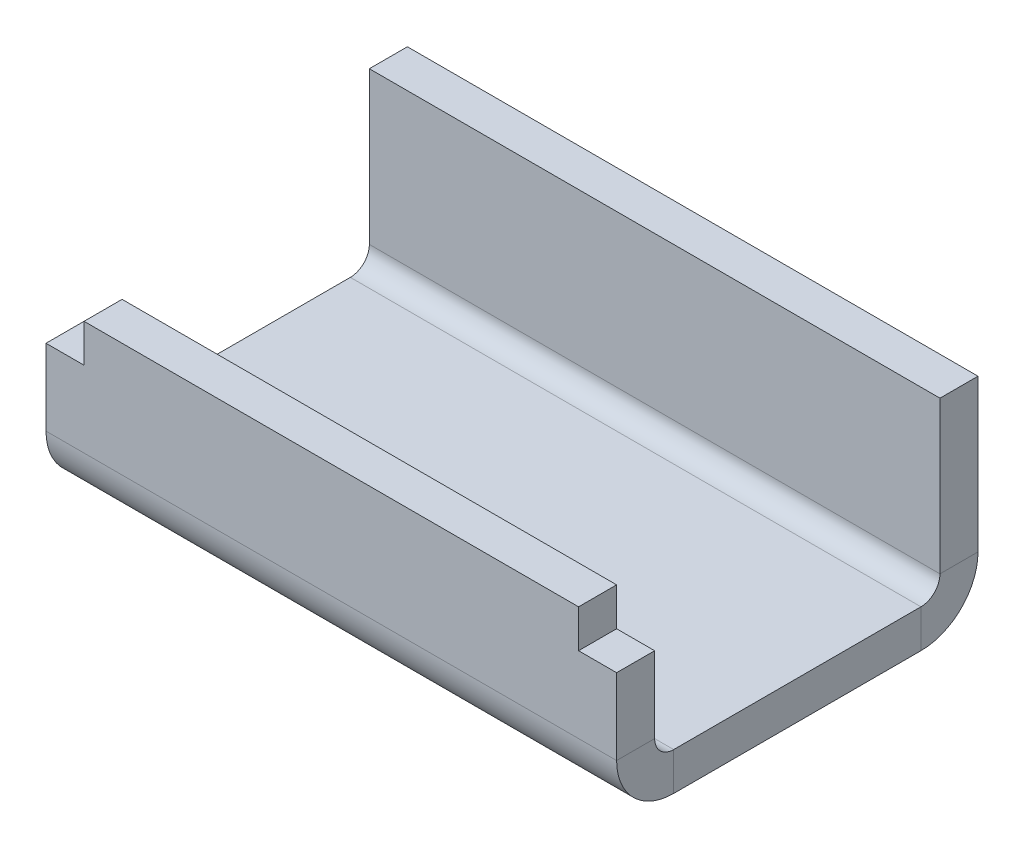
ISO-10303-21;
HEADER;
FILE_DESCRIPTION(('STEP AP214'),'2;1');
FILE_NAME('part.step','',(''),(''),'','','');
FILE_SCHEMA(('AUTOMOTIVE_DESIGN { 1 0 10303 214 1 1 1 1 }'));
ENDSEC;
DATA;
#1=APPLICATION_CONTEXT('core data for automotive mechanical design processes');
#2=APPLICATION_PROTOCOL_DEFINITION('international standard','automotive_design',2000,#1);
#3=PRODUCT_CONTEXT('',#1,'mechanical');
#4=PRODUCT('Part','Part','',(#3));
#5=PRODUCT_RELATED_PRODUCT_CATEGORY('part','',(#4));
#6=PRODUCT_DEFINITION_FORMATION('','',#4);
#7=PRODUCT_DEFINITION_CONTEXT('part definition',#1,'design');
#8=PRODUCT_DEFINITION('design','',#6,#7);
#9=PRODUCT_DEFINITION_SHAPE('','',#8);
#10=(LENGTH_UNIT() NAMED_UNIT(*) SI_UNIT(.MILLI.,.METRE.));
#11=(NAMED_UNIT(*) PLANE_ANGLE_UNIT() SI_UNIT($,.RADIAN.));
#12=(NAMED_UNIT(*) SI_UNIT($,.STERADIAN.) SOLID_ANGLE_UNIT());
#13=UNCERTAINTY_MEASURE_WITH_UNIT(LENGTH_MEASURE(1.E-05),#10,'distance_accuracy_value','');
#14=(GEOMETRIC_REPRESENTATION_CONTEXT(3) GLOBAL_UNCERTAINTY_ASSIGNED_CONTEXT((#13)) GLOBAL_UNIT_ASSIGNED_CONTEXT((#10,
#11,#12)) REPRESENTATION_CONTEXT('',''));
#15=CARTESIAN_POINT('',(0.,0.,0.));
#16=DIRECTION('',(0.,0.,1.));
#17=DIRECTION('',(1.,0.,0.));
#18=AXIS2_PLACEMENT_3D('',#15,#16,#17);
#19=CARTESIAN_POINT('',(-5.39078E-12,-0.06434426229563,-0.02));
#20=DIRECTION('',(0.,0.,1.));
#21=DIRECTION('',(0.,-1.,0.));
#22=AXIS2_PLACEMENT_3D('',#19,#20,#21);
#23=PLANE('',#22);
#24=DIRECTION('',(1.,0.,0.));
#25=VECTOR('',#24,1.);
#26=CARTESIAN_POINT('',(-0.150000000006,0.01,-0.02));
#27=LINE('',#26,#25);
#28=CARTESIAN_POINT('',(-0.150000000006,0.01,-0.02));
#29=VERTEX_POINT('',#28);
#30=CARTESIAN_POINT('',(0.149999999994,0.01,-0.02));
#31=VERTEX_POINT('',#30);
#32=EDGE_CURVE('E293',#29,#31,#27,.T.);
#33=ORIENTED_EDGE('',*,*,#32,.F.);
#34=DIRECTION('',(0.,1.,0.));
#35=VECTOR('',#34,1.);
#36=CARTESIAN_POINT('',(-0.150000000006,-0.200000000011,-0.02));
#37=LINE('',#36,#35);
#38=CARTESIAN_POINT('',(-0.150000000006,0.09,-0.02));
#39=VERTEX_POINT('',#38);
#40=EDGE_CURVE('E27',#29,#39,#37,.T.);
#41=ORIENTED_EDGE('',*,*,#40,.T.);
#42=DIRECTION('',(1.,0.,0.));
#43=VECTOR('',#42,1.);
#44=CARTESIAN_POINT('',(-0.150000000006,0.09,-0.02));
#45=LINE('',#44,#43);
#46=CARTESIAN_POINT('',(0.149999999994,0.09,-0.02));
#47=VERTEX_POINT('',#46);
#48=EDGE_CURVE('E11',#39,#47,#45,.T.);
#49=ORIENTED_EDGE('',*,*,#48,.T.);
#50=DIRECTION('',(0.,-1.,0.));
#51=VECTOR('',#50,1.);
#52=CARTESIAN_POINT('',(0.149999999994,0.09,-0.02));
#53=LINE('',#52,#51);
#54=EDGE_CURVE('E307',#47,#31,#53,.T.);
#55=ORIENTED_EDGE('',*,*,#54,.T.);
#56=EDGE_LOOP('',(#33,#41,#49,#55));
#57=FACE_BOUND('',#56,.T.);
#58=ADVANCED_FACE('F17',(#57),#23,.F.);
#59=CARTESIAN_POINT('',(-0.150000000006,0.09,0.));
#60=DIRECTION('',(0.,-1.,0.));
#61=DIRECTION('',(0.,0.,-1.));
#62=AXIS2_PLACEMENT_3D('',#59,#60,#61);
#63=PLANE('',#62);
#64=DIRECTION('',(0.,0.,-1.));
#65=VECTOR('',#64,1.);
#66=CARTESIAN_POINT('',(-0.150000000006,0.09,0.));
#67=LINE('',#66,#65);
#68=CARTESIAN_POINT('',(-0.150000000006,0.09,0.));
#69=VERTEX_POINT('',#68);
#70=EDGE_CURVE('E225',#69,#39,#67,.T.);
#71=ORIENTED_EDGE('',*,*,#70,.F.);
#72=DIRECTION('',(1.,0.,0.));
#73=VECTOR('',#72,1.);
#74=CARTESIAN_POINT('',(-0.150000000006,0.09,0.));
#75=LINE('',#74,#73);
#76=CARTESIAN_POINT('',(0.149999999994,0.09,0.));
#77=VERTEX_POINT('',#76);
#78=EDGE_CURVE('E294',#69,#77,#75,.T.);
#79=ORIENTED_EDGE('',*,*,#78,.T.);
#80=DIRECTION('',(0.,0.,-1.));
#81=VECTOR('',#80,1.);
#82=CARTESIAN_POINT('',(0.149999999994,0.09,0.));
#83=LINE('',#82,#81);
#84=EDGE_CURVE('E21',#77,#47,#83,.T.);
#85=ORIENTED_EDGE('',*,*,#84,.T.);
#86=ORIENTED_EDGE('',*,*,#48,.F.);
#87=EDGE_LOOP('',(#71,#79,#85,#86));
#88=FACE_BOUND('',#87,.T.);
#89=ADVANCED_FACE('F315',(#88),#63,.F.);
#90=CARTESIAN_POINT('',(-0.150000000006,-0.200000000011,0.));
#91=DIRECTION('',(1.,0.,0.));
#92=DIRECTION('',(0.,1.,0.));
#93=AXIS2_PLACEMENT_3D('',#90,#91,#92);
#94=PLANE('',#93);
#95=DIRECTION('',(0.,1.,0.));
#96=VECTOR('',#95,1.);
#97=CARTESIAN_POINT('',(-0.150000000006,-0.200000000011,0.));
#98=LINE('',#97,#96);
#99=CARTESIAN_POINT('',(-0.150000000006,0.01,0.));
#100=VERTEX_POINT('',#99);
#101=EDGE_CURVE('E289',#100,#69,#98,.T.);
#102=ORIENTED_EDGE('',*,*,#101,.T.);
#103=ORIENTED_EDGE('',*,*,#70,.T.);
#104=ORIENTED_EDGE('',*,*,#40,.F.);
#105=DIRECTION('',(0.,0.,-1.));
#106=VECTOR('',#105,1.);
#107=CARTESIAN_POINT('',(-0.150000000006,0.01,0.));
#108=LINE('',#107,#106);
#109=EDGE_CURVE('E288',#100,#29,#108,.T.);
#110=ORIENTED_EDGE('',*,*,#109,.F.);
#111=EDGE_LOOP('',(#102,#103,#104,#110));
#112=FACE_BOUND('',#111,.T.);
#113=ADVANCED_FACE('F19',(#112),#94,.F.);
#114=CARTESIAN_POINT('',(0.149999999994,0.09,0.));
#115=DIRECTION('',(-1.,0.,0.));
#116=DIRECTION('',(0.,0.,1.));
#117=AXIS2_PLACEMENT_3D('',#114,#115,#116);
#118=PLANE('',#117);
#119=DIRECTION('',(0.,-1.,0.));
#120=VECTOR('',#119,1.);
#121=CARTESIAN_POINT('',(0.149999999994,0.09,0.));
#122=LINE('',#121,#120);
#123=CARTESIAN_POINT('',(0.149999999994,0.01,0.));
#124=VERTEX_POINT('',#123);
#125=EDGE_CURVE('E204',#77,#124,#122,.T.);
#126=ORIENTED_EDGE('',*,*,#125,.T.);
#127=DIRECTION('',(0.,0.,-1.));
#128=VECTOR('',#127,1.);
#129=CARTESIAN_POINT('',(0.149999999994,0.01,0.));
#130=LINE('',#129,#128);
#131=EDGE_CURVE('E284',#124,#31,#130,.T.);
#132=ORIENTED_EDGE('',*,*,#131,.T.);
#133=ORIENTED_EDGE('',*,*,#54,.F.);
#134=ORIENTED_EDGE('',*,*,#84,.F.);
#135=EDGE_LOOP('',(#126,#132,#133,#134));
#136=FACE_BOUND('',#135,.T.);
#137=ADVANCED_FACE('F319',(#136),#118,.F.);
#138=CARTESIAN_POINT('',(-0.150000000006,0.01,0.01));
#139=DIRECTION('',(1.,0.,0.));
#140=DIRECTION('',(0.,0.,1.));
#141=AXIS2_PLACEMENT_3D('',#138,#139,#140);
#142=CYLINDRICAL_SURFACE('',#141,0.03);
#143=DIRECTION('',(-1.,0.,0.));
#144=VECTOR('',#143,1.);
#145=CARTESIAN_POINT('',(-0.150000000006,-0.02,0.01));
#146=LINE('',#145,#144);
#147=CARTESIAN_POINT('',(0.149999999994,-0.02,0.01));
#148=VERTEX_POINT('',#147);
#149=CARTESIAN_POINT('',(-0.150000000006,-0.02,0.01));
#150=VERTEX_POINT('',#149);
#151=EDGE_CURVE('E277',#148,#150,#146,.T.);
#152=ORIENTED_EDGE('',*,*,#151,.T.);
#153=CARTESIAN_POINT('',(-0.150000000006,0.00999999999999739,0.00999999999999739));
#154=DIRECTION('',(1.,0.,0.));
#155=DIRECTION('',(0.,0.,-1.));
#156=AXIS2_PLACEMENT_3D('',#153,#154,#155);
#157=CIRCLE('',#156,0.0299999999999974);
#158=EDGE_CURVE('E298',#150,#29,#157,.T.);
#159=ORIENTED_EDGE('',*,*,#158,.T.);
#160=ORIENTED_EDGE('',*,*,#32,.T.);
#161=CARTESIAN_POINT('',(0.149999999994,0.00999999999999722,0.00999999999999725));
#162=DIRECTION('',(-1.,0.,0.));
#163=DIRECTION('',(0.,-1.,0.));
#164=AXIS2_PLACEMENT_3D('',#161,#162,#163);
#165=CIRCLE('',#164,0.0299999999999972);
#166=EDGE_CURVE('E281',#31,#148,#165,.T.);
#167=ORIENTED_EDGE('',*,*,#166,.T.);
#168=EDGE_LOOP('',(#152,#159,#160,#167));
#169=FACE_BOUND('',#168,.T.);
#170=ADVANCED_FACE('F328',(#169),#142,.T.);
#171=CARTESIAN_POINT('',(-5.39078E-12,-0.06434426229563,0.));
#172=DIRECTION('',(0.,0.,1.));
#173=DIRECTION('',(0.,-1.,0.));
#174=AXIS2_PLACEMENT_3D('',#171,#172,#173);
#175=PLANE('',#174);
#176=DIRECTION('',(1.,0.,0.));
#177=VECTOR('',#176,1.);
#178=CARTESIAN_POINT('',(-0.150000000006,0.01,0.));
#179=LINE('',#178,#177);
#180=EDGE_CURVE('E245',#100,#124,#179,.T.);
#181=ORIENTED_EDGE('',*,*,#180,.T.);
#182=ORIENTED_EDGE('',*,*,#125,.F.);
#183=ORIENTED_EDGE('',*,*,#78,.F.);
#184=ORIENTED_EDGE('',*,*,#101,.F.);
#185=EDGE_LOOP('',(#181,#182,#183,#184));
#186=FACE_BOUND('',#185,.T.);
#187=ADVANCED_FACE('F366',(#186),#175,.T.);
#188=CARTESIAN_POINT('',(-0.150000000006,0.00293014320761232,0.0029301432076107));
#189=DIRECTION('',(-1.,0.,0.));
#190=DIRECTION('',(0.,0.,1.));
#191=AXIS2_PLACEMENT_3D('',#188,#189,#190);
#192=PLANE('',#191);
#193=CARTESIAN_POINT('',(-0.150000000006,0.,0.01));
#194=CARTESIAN_POINT('',(-0.150000000006,0.,0.009893145140566));
#195=CARTESIAN_POINT('',(-0.150000000006,1.71273217497177E-06,0.00978629333149694));
#196=CARTESIAN_POINT('',(-0.150000000006,5.13767503647344E-06,0.00967948930591211));
#197=CARTESIAN_POINT('',(-0.150000000006,8.5626178979759E-06,0.00957268528032725));
#198=CARTESIAN_POINT('',(-0.150000000006,1.36997278971819E-05,0.00946593514359925));
#199=CARTESIAN_POINT('',(-0.150000000006,2.05460724966439E-05,0.00935929780019276));
#200=CARTESIAN_POINT('',(-0.150000000006,2.73924170960974E-05,0.00925266045678639));
#201=CARTESIAN_POINT('',(-0.150000000006,3.59481483652578E-05,0.00914613285964536));
#202=CARTESIAN_POINT('',(-0.150000000006,4.62088705079945E-05,0.00903976974092342));
#203=CARTESIAN_POINT('',(-0.150000000006,5.64695926507638E-05,0.00893340662220115));
#204=CARTESIAN_POINT('',(-0.150000000006,6.84353056671169E-05,0.00882720798189799));
#205=CARTESIAN_POINT('',(-0.150000000006,8.20998617675744E-05,0.00872122838315467));
#206=CARTESIAN_POINT('',(-0.150000000006,9.57644178679983E-05,0.00861524878441161));
#207=CARTESIAN_POINT('',(-0.150000000006,0.00011112781705252,0.00850948822722841));
#208=CARTESIAN_POINT('',(-0.150000000006,0.000128182165855533,0.00840400104966599));
#209=CARTESIAN_POINT('',(-0.150000000006,0.000145236514658547,0.00829851387210358));
#210=CARTESIAN_POINT('',(-0.150000000006,0.000163981813080051,0.00819330007416197));
#211=CARTESIAN_POINT('',(-0.150000000006,0.000184408430089385,0.00808841371298608));
#212=CARTESIAN_POINT('',(-0.150000000006,0.000204835047098718,0.0079835273518102));
#213=CARTESIAN_POINT('',(-0.150000000006,0.000226942982695879,0.00787896842740005));
#214=CARTESIAN_POINT('',(-0.150000000006,0.000250720878181752,0.00777479066043691));
#215=CARTESIAN_POINT('',(-0.150000000006,0.000274498773667626,0.00767061289347377));
#216=CARTESIAN_POINT('',(-0.150000000006,0.000299946629042216,0.00756681628395764));
#217=CARTESIAN_POINT('',(-0.150000000006,0.000327051369609675,0.00746345416090504));
#218=CARTESIAN_POINT('',(-0.150000000006,0.000381260850744594,0.00725672991479985));
#219=CARTESIAN_POINT('',(-0.150000000006,0.000442099560027939,0.00705174411535318));
#220=CARTESIAN_POINT('',(-0.150000000006,0.000509442529893238,0.00684891781976402));
#221=CARTESIAN_POINT('',(-0.150000000006,0.000543114014825887,0.00674750467196944));
#222=CARTESIAN_POINT('',(-0.150000000006,0.00057841114305978,0.00664663127493813));
#223=CARTESIAN_POINT('',(-0.150000000006,0.000615315779502293,0.0065463494557872));
#224=CARTESIAN_POINT('',(-0.150000000006,0.000652220415944894,0.00644606763663603));
#225=CARTESIAN_POINT('',(-0.150000000006,0.000690732560596126,0.00634637739536524));
#226=CARTESIAN_POINT('',(-0.150000000006,0.000730832426539943,0.00624732995120586));
#227=CARTESIAN_POINT('',(-0.150000000006,0.000770932292483661,0.00614828250704672));
#228=CARTESIAN_POINT('',(-0.150000000006,0.000812619879719954,0.00604987785999899));
#229=CARTESIAN_POINT('',(-0.150000000006,0.000855873769841952,0.00595216656877589));
#230=CARTESIAN_POINT('',(-0.150000000006,0.00089912765996395,0.00585445527755279));
#231=CARTESIAN_POINT('',(-0.150000000006,0.000943947852971657,0.00575743734215433));
#232=CARTESIAN_POINT('',(-0.150000000006,0.000990311320975899,0.00566116260882423));
#233=CARTESIAN_POINT('',(-0.150000000006,0.00103667478898014,0.00556488787549413));
#234=CARTESIAN_POINT('',(-0.150000000006,0.00108458153198091,0.00546935634423239));
#235=CARTESIAN_POINT('',(-0.150000000006,0.0011340069362699,0.00537461709759184));
#236=CARTESIAN_POINT('',(-0.150000000006,0.00128228314913687,0.00509039935767018));
#237=CARTESIAN_POINT('',(-0.150000000006,0.00144423645844276,0.00481331745911238));
#238=CARTESIAN_POINT('',(-0.150000000006,0.00161911895108181,0.00454465098789418));
#239=CARTESIAN_POINT('',(-0.150000000006,0.00167741311529483,0.00445509549748811));
#240=CARTESIAN_POINT('',(-0.150000000006,0.00173714284566688,0.00436647445709802));
#241=CARTESIAN_POINT('',(-0.150000000006,0.00179827745403031,0.00427883339877848));
#242=CARTESIAN_POINT('',(-0.150000000006,0.0018594120623939,0.00419119234045873));
#243=CARTESIAN_POINT('',(-0.150000000006,0.00192195154874889,0.00410453126420954));
#244=CARTESIAN_POINT('',(-0.150000000006,0.00198586378132042,0.00401889469508785));
#245=CARTESIAN_POINT('',(-0.150000000006,0.0020497760138918,0.00393325812596638));
#246=CARTESIAN_POINT('',(-0.150000000006,0.00211506099267971,0.00384864606397241));
#247=CARTESIAN_POINT('',(-0.150000000006,0.00218168517531969,0.00376510198141269));
#248=CARTESIAN_POINT('',(-0.150000000006,0.00224830935795966,0.00368155789885295));
#249=CARTESIAN_POINT('',(-0.150000000006,0.00231627274445171,0.00359908179572746));
#250=CARTESIAN_POINT('',(-0.150000000006,0.00238554041630878,0.00351771604692197));
#251=CARTESIAN_POINT('',(-0.150000000006,0.00245480808816585,0.00343635029811647));
#252=CARTESIAN_POINT('',(-0.150000000006,0.00252538004538794,0.00335609490363096));
#253=CARTESIAN_POINT('',(-0.150000000006,0.00259722002924699,0.00327699109738667));
#254=CARTESIAN_POINT('',(-0.150000000006,0.00266906001310604,0.00319788729114238));
#255=CARTESIAN_POINT('',(-0.150000000006,0.00274216802360205,0.00311993507313931));
#256=CARTESIAN_POINT('',(-0.150000000006,0.00281650649902325,0.0030431744939646));
#257=CARTESIAN_POINT('',(-0.150000000006,0.0028908449744439,0.00296641391479045));
#258=CARTESIAN_POINT('',(-0.150000000006,0.00296641391478971,0.00289084497444464));
#259=CARTESIAN_POINT('',(-0.150000000006,0.00304317449396359,0.00281650649902422));
#260=CARTESIAN_POINT('',(-0.150000000006,0.00311993507313879,0.00274216802360253));
#261=CARTESIAN_POINT('',(-0.150000000006,0.00319788729114211,0.00266906001310627));
#262=CARTESIAN_POINT('',(-0.150000000006,0.00327699109738686,0.00259722002924682));
#263=CARTESIAN_POINT('',(-0.150000000006,0.00335609490363161,0.00252538004538736));
#264=CARTESIAN_POINT('',(-0.150000000006,0.00343635029811778,0.0024548080881647));
#265=CARTESIAN_POINT('',(-0.150000000006,0.00351771604692396,0.00238554041630708));
#266=CARTESIAN_POINT('',(-0.150000000006,0.00359908179572815,0.00231627274445117));
#267=CARTESIAN_POINT('',(-0.150000000006,0.00368155789885228,0.00224830935796023));
#268=CARTESIAN_POINT('',(-0.150000000006,0.00376510198141101,0.00218168517532102));
#269=CARTESIAN_POINT('',(-0.150000000006,0.00384864606397178,0.00211506099268018));
#270=CARTESIAN_POINT('',(-0.150000000006,0.0039332581259672,0.00204977601389115));
#271=CARTESIAN_POINT('',(-0.150000000006,0.00401889469508981,0.00198586378131896));
#272=CARTESIAN_POINT('',(-0.150000000006,0.00410453126421032,0.00192195154874834));
#273=CARTESIAN_POINT('',(-0.150000000006,0.00419119234045796,0.00185941206239448));
#274=CARTESIAN_POINT('',(-0.150000000006,0.00427883339877623,0.00179827745403189));
#275=CARTESIAN_POINT('',(-0.150000000006,0.00436647445709665,0.0017371428456678));
#276=CARTESIAN_POINT('',(-0.150000000006,0.00445509549748777,0.00167741311529504));
#277=CARTESIAN_POINT('',(-0.150000000006,0.00454465098789468,0.00161911895108148));
#278=CARTESIAN_POINT('',(-0.150000000006,0.0046342064783016,0.00156082478686792));
#279=CARTESIAN_POINT('',(-0.150000000006,0.00472469641872432,0.00150396618881355));
#280=CARTESIAN_POINT('',(-0.150000000006,0.00481607431689735,0.00144857236994496));
#281=CARTESIAN_POINT('',(-0.150000000006,0.00490745221506815,0.00139317855107772));
#282=CARTESIAN_POINT('',(-0.150000000006,0.00499971807098923,0.00133924951139618));
#283=CARTESIAN_POINT('',(-0.150000000006,0.00509282447995906,0.00128681295876699));
#284=CARTESIAN_POINT('',(-0.150000000006,0.00518593088893116,0.00123437640613651));
#285=CARTESIAN_POINT('',(-0.150000000006,0.00527987785095204,0.00118343234055847));
#286=CARTESIAN_POINT('',(-0.150000000006,0.0053746170975939,0.00113400693626882));
#287=CARTESIAN_POINT('',(-0.150000000006,0.00546935634423343,0.00108458153198039));
#288=CARTESIAN_POINT('',(-0.150000000006,0.0055648878754939,0.00103667478898028));
#289=CARTESIAN_POINT('',(-0.150000000006,0.00566116260882242,0.000990311320976772));
#290=CARTESIAN_POINT('',(-0.150000000006,0.0057574373421533,0.000943947852972129));
#291=CARTESIAN_POINT('',(-0.150000000006,0.00585445527755229,0.000899127659964166));
#292=CARTESIAN_POINT('',(-0.150000000006,0.0059521665687761,0.000855873769841859));
#293=CARTESIAN_POINT('',(-0.150000000006,0.0060498778599999,0.000812619879719553));
#294=CARTESIAN_POINT('',(-0.150000000006,0.00614828250704853,0.000770932292482897));
#295=CARTESIAN_POINT('',(-0.150000000006,0.00624732995120857,0.000730832426538847));
#296=CARTESIAN_POINT('',(-0.150000000006,0.00634637739536618,0.00069073256059578));
#297=CARTESIAN_POINT('',(-0.150000000006,0.00644606763663518,0.000652220415945242));
#298=CARTESIAN_POINT('',(-0.150000000006,0.00654634945578453,0.000615315779503276));
#299=CARTESIAN_POINT('',(-0.150000000006,0.00664663127493634,0.000578411143060407));
#300=CARTESIAN_POINT('',(-0.150000000006,0.00674750467196854,0.000543114014826186));
#301=CARTESIAN_POINT('',(-0.150000000006,0.00684891781976399,0.000509442529893248));
#302=CARTESIAN_POINT('',(-0.150000000006,0.00695033096755943,0.000475771044960313));
#303=CARTESIAN_POINT('',(-0.150000000006,0.00705228386611812,0.000443725203328662));
#304=CARTESIAN_POINT('',(-0.150000000006,0.00715472413369243,0.000413321469632577));
#305=CARTESIAN_POINT('',(-0.150000000006,0.00725716440126422,0.000382917735937237));
#306=CARTESIAN_POINT('',(-0.150000000006,0.00736009203785161,0.000354156110177378));
#307=CARTESIAN_POINT('',(-0.150000000006,0.00746345416090294,0.000327051369610228));
#308=CARTESIAN_POINT('',(-0.150000000006,0.0075668162839568,0.000299946629042414));
#309=CARTESIAN_POINT('',(-0.150000000006,0.00767061289347463,0.000274498773667405));
#310=CARTESIAN_POINT('',(-0.150000000006,0.00777479066043905,0.000250720878181262));
#311=CARTESIAN_POINT('',(-0.150000000006,0.00787896842740093,0.000226942982695701));
#312=CARTESIAN_POINT('',(-0.150000000006,0.00798352735180936,0.000204835047098909));
#313=CARTESIAN_POINT('',(-0.150000000006,0.00808841371298352,0.000184408430089883));
#314=CARTESIAN_POINT('',(-0.150000000006,0.00819330007416025,0.000163981813080356));
#315=CARTESIAN_POINT('',(-0.150000000006,0.00829851387210272,0.000145236514658685));
#316=CARTESIAN_POINT('',(-0.150000000006,0.00840400104966604,0.000128182165855526));
#317=CARTESIAN_POINT('',(-0.150000000006,0.00850948822722936,0.000111127817052367));
#318=CARTESIAN_POINT('',(-0.150000000006,0.00861524878441351,9.57644178677224E-05));
#319=CARTESIAN_POINT('',(-0.150000000006,0.00872122838315751,8.20998617672083E-05));
#320=CARTESIAN_POINT('',(-0.150000000006,0.00882720798189891,6.84353056670288E-05));
#321=CARTESIAN_POINT('',(-0.150000000006,0.00893340662220015,5.64695926508876E-05));
#322=CARTESIAN_POINT('',(-0.150000000006,0.00903976974092092,4.62088705082356E-05));
#323=CARTESIAN_POINT('',(-0.150000000006,0.0091461328596443,3.59481483653326E-05));
#324=CARTESIAN_POINT('',(-0.150000000006,0.00925266045678724,2.73924170960174E-05));
#325=CARTESIAN_POINT('',(-0.150000000006,0.00935929780019519,2.05460724964877E-05));
#326=CARTESIAN_POINT('',(-0.150000000006,0.00946593514360054,1.3699727897126E-05));
#327=CARTESIAN_POINT('',(-0.150000000006,0.00957268528032707,8.56261789800169E-06));
#328=CARTESIAN_POINT('',(-0.150000000006,0.00967948930591028,5.13767503653242E-06));
#329=CARTESIAN_POINT('',(-0.150000000006,0.00978629333149611,1.71273217497933E-06));
#330=CARTESIAN_POINT('',(-0.150000000006,0.009893145140566,0.));
#331=CARTESIAN_POINT('',(-0.150000000006,0.01,0.));
#332=(BOUNDED_CURVE() B_SPLINE_CURVE(3,(#193,#194,#195,#196,#197,#198,#199,#200,#201,#202,#203,
#204,#205,#206,#207,#208,#209,#210,#211,#212,#213,#214,#215,#216,#217,#218,#219,#220,#221,#222,
#223,#224,#225,#226,#227,#228,#229,#230,#231,#232,#233,#234,#235,#236,#237,#238,#239,#240,#241,
#242,#243,#244,#245,#246,#247,#248,#249,#250,#251,#252,#253,#254,#255,#256,#257,#258,#259,#260,
#261,#262,#263,#264,#265,#266,#267,#268,#269,#270,#271,#272,#273,#274,#275,#276,#277,#278,#279,
#280,#281,#282,#283,#284,#285,#286,#287,#288,#289,#290,#291,#292,#293,#294,#295,#296,#297,#298,
#299,#300,#301,#302,#303,#304,#305,#306,#307,#308,#309,#310,#311,#312,#313,#314,#315,#316,#317,
#318,#319,#320,#321,#322,#323,#324,#325,#326,#327,#328,#329,#330,#331),.UNSPECIFIED.,.F.,
.F.) B_SPLINE_CURVE_WITH_KNOTS((4,3,3,3,3,3,3,3,3,3,3,3,3,3,3,3,3,3,3,3,3,3,3,3,3,3,3,3,3,3,3,3,
3,3,3,3,3,3,3,3,3,3,3,3,3,3,4),(0.,0.0004081632653061,0.0008163265306123,0.001224489795918,
0.001632653061225,0.002040816326531,0.002448979591837,0.002857142857143,0.003265306122449,
0.004081632653061,0.004489795918367,0.004897959183674,0.00530612244898,0.005714285714286,
0.006122448979592,0.00734693877551,0.007755102040816,0.008163265306123,0.008571428571429,
0.008979591836735,0.009387755102041,0.009795918367347,0.01020408163265,0.01061224489796,
0.01102040816327,0.01142857142857,0.01183673469388,0.01224489795918,0.01265306122449,
0.0130612244898,0.0134693877551,0.01387755102041,0.01428571428571,0.01469387755102,
0.01510204081633,0.01551020408163,0.01591836734694,0.01632653061225,0.01673469387755,
0.01714285714286,0.01755102040816,0.01795918367347,0.01836734693878,0.01877551020408,
0.01918367346939,0.01959183673469,0.02),
.UNSPECIFIED.) CURVE() GEOMETRIC_REPRESENTATION_ITEM() RATIONAL_B_SPLINE_CURVE((1.,1.,1.,1.,1.,
1.,1.,1.,1.,1.,1.,1.,1.,1.,1.,1.,1.,1.,1.,1.,1.,1.,1.,1.,1.,1.,1.,1.,1.,1.,1.,1.,1.,1.,1.,1.,1.,
1.,1.,1.,1.,1.,1.,1.,1.,1.,1.,1.,1.,1.,1.,1.,1.,1.,1.,1.,1.,1.,1.,1.,1.,1.,1.,1.,1.,1.,1.,1.,1.,
1.,1.,1.,1.,1.,1.,1.,1.,1.,1.,1.,1.,1.,1.,1.,1.,1.,1.,1.,1.,1.,1.,1.,1.,1.,1.,1.,1.,1.,1.,1.,1.,
1.,1.,1.,1.,1.,1.,1.,1.,1.,1.,1.,1.,1.,1.,1.,1.,1.,1.,1.,1.,1.,1.,1.,1.,1.,1.,1.,1.,1.,1.,1.,1.,
1.,1.,1.,1.,1.,1.)) REPRESENTATION_ITEM(''));
#333=CARTESIAN_POINT('',(-0.150000000006,0.,0.01));
#334=VERTEX_POINT('',#333);
#335=EDGE_CURVE('E252',#334,#100,#332,.T.);
#336=ORIENTED_EDGE('',*,*,#335,.T.);
#337=ORIENTED_EDGE('',*,*,#109,.T.);
#338=ORIENTED_EDGE('',*,*,#158,.F.);
#339=DIRECTION('',(0.,-1.,0.));
#340=VECTOR('',#339,1.);
#341=CARTESIAN_POINT('',(-0.150000000006,0.,0.01));
#342=LINE('',#341,#340);
#343=EDGE_CURVE('E224',#334,#150,#342,.T.);
#344=ORIENTED_EDGE('',*,*,#343,.F.);
#345=EDGE_LOOP('',(#336,#337,#338,#344));
#346=FACE_BOUND('',#345,.T.);
#347=ADVANCED_FACE('F344',(#346),#192,.T.);
#348=CARTESIAN_POINT('',(0.149999999994,0.0029301432076107,0.00293014320761232));
#349=DIRECTION('',(1.,0.,0.));
#350=DIRECTION('',(0.,-1.,0.));
#351=AXIS2_PLACEMENT_3D('',#348,#349,#350);
#352=PLANE('',#351);
#353=CARTESIAN_POINT('',(0.149999999994,0.01,0.));
#354=CARTESIAN_POINT('',(0.149999999994,0.00859053317721571,0.));
#355=CARTESIAN_POINT('',(0.149999999994,0.00718175735288133,0.000302362106215972));
#356=CARTESIAN_POINT('',(0.149999999994,0.00589640641263964,0.000880761014768012));
#357=CARTESIAN_POINT('',(0.149999999994,0.00461543584935873,0.00145718878440862));
#358=CARTESIAN_POINT('',(0.149999999994,0.00345835388561739,0.00230714482904098));
#359=CARTESIAN_POINT('',(0.149999999994,0.0025252347285721,0.00335711778389415));
#360=CARTESIAN_POINT('',(0.149999999994,0.00158933743889387,0.00441021677480344));
#361=CARTESIAN_POINT('',(0.149999999994,0.000879740273415373,0.00566343641291589));
#362=CARTESIAN_POINT('',(0.149999999994,0.000458171608540076,0.00700775820697436));
#363=CARTESIAN_POINT('',(0.149999999994,0.000155077984115554,0.00797428014966805));
#364=CARTESIAN_POINT('',(0.149999999994,0.,0.0089870876872118));
#365=CARTESIAN_POINT('',(0.149999999994,0.,0.01));
#366=(BOUNDED_CURVE() B_SPLINE_CURVE(3,(#353,#354,#355,#356,#357,#358,#359,#360,#361,#362,#363,
#364,#365),.UNSPECIFIED.,.F.,.F.) B_SPLINE_CURVE_WITH_KNOTS((4,3,3,3,4),(0.,0.00538386914526424,
0.010749390479339,0.0161308863326361,0.02),
.UNSPECIFIED.) CURVE() GEOMETRIC_REPRESENTATION_ITEM() RATIONAL_B_SPLINE_CURVE((1.,1.,1.,1.,1.,
1.,1.,1.,1.,1.,1.,1.,1.)) REPRESENTATION_ITEM(''));
#367=CARTESIAN_POINT('',(0.149999999994,0.,0.01));
#368=VERTEX_POINT('',#367);
#369=EDGE_CURVE('E240',#124,#368,#366,.T.);
#370=ORIENTED_EDGE('',*,*,#369,.T.);
#371=DIRECTION('',(0.,-1.,0.));
#372=VECTOR('',#371,1.);
#373=CARTESIAN_POINT('',(0.149999999994,0.,0.01));
#374=LINE('',#373,#372);
#375=EDGE_CURVE('E220',#368,#148,#374,.T.);
#376=ORIENTED_EDGE('',*,*,#375,.T.);
#377=ORIENTED_EDGE('',*,*,#166,.F.);
#378=ORIENTED_EDGE('',*,*,#131,.F.);
#379=EDGE_LOOP('',(#370,#376,#377,#378));
#380=FACE_BOUND('',#379,.T.);
#381=ADVANCED_FACE('F323',(#380),#352,.T.);
#382=CARTESIAN_POINT('',(-5.39078E-12,-0.02,0.06434426229563));
#383=DIRECTION('',(0.,1.,0.));
#384=DIRECTION('',(0.,0.,-1.));
#385=AXIS2_PLACEMENT_3D('',#382,#383,#384);
#386=PLANE('',#385);
#387=DIRECTION('',(1.,0.,0.));
#388=VECTOR('',#387,1.);
#389=CARTESIAN_POINT('',(0.149999999994,-0.02,0.14));
#390=LINE('',#389,#388);
#391=CARTESIAN_POINT('',(-0.150000000006,-0.02,0.14));
#392=VERTEX_POINT('',#391);
#393=CARTESIAN_POINT('',(0.149999999994,-0.02,0.14));
#394=VERTEX_POINT('',#393);
#395=EDGE_CURVE('E213',#392,#394,#390,.T.);
#396=ORIENTED_EDGE('',*,*,#395,.F.);
#397=DIRECTION('',(0.,0.,-1.));
#398=VECTOR('',#397,1.);
#399=CARTESIAN_POINT('',(-0.150000000006,-0.02,0.200000000011));
#400=LINE('',#399,#398);
#401=EDGE_CURVE('E233',#392,#150,#400,.T.);
#402=ORIENTED_EDGE('',*,*,#401,.T.);
#403=ORIENTED_EDGE('',*,*,#151,.F.);
#404=DIRECTION('',(0.,0.,1.));
#405=VECTOR('',#404,1.);
#406=CARTESIAN_POINT('',(0.149999999994,-0.02,-0.09));
#407=LINE('',#406,#405);
#408=EDGE_CURVE('E217',#148,#394,#407,.T.);
#409=ORIENTED_EDGE('',*,*,#408,.T.);
#410=EDGE_LOOP('',(#396,#402,#403,#409));
#411=FACE_BOUND('',#410,.T.);
#412=ADVANCED_FACE('F332',(#411),#386,.F.);
#413=CARTESIAN_POINT('',(-5.39078E-12,-0.08565573770437,0.17));
#414=DIRECTION('',(0.,0.,-1.));
#415=DIRECTION('',(-1.,0.,0.));
#416=AXIS2_PLACEMENT_3D('',#413,#414,#415);
#417=PLANE('',#416);
#418=DIRECTION('',(-1.,0.,0.));
#419=VECTOR('',#418,1.);
#420=CARTESIAN_POINT('',(0.130000000006,0.07,0.17));
#421=LINE('',#420,#419);
#422=CARTESIAN_POINT('',(0.130000000006,0.07,0.17));
#423=VERTEX_POINT('',#422);
#424=CARTESIAN_POINT('',(-0.130000000006,0.07,0.17));
#425=VERTEX_POINT('',#424);
#426=EDGE_CURVE('E178',#423,#425,#421,.T.);
#427=ORIENTED_EDGE('',*,*,#426,.T.);
#428=DIRECTION('',(0.,-1.,0.));
#429=VECTOR('',#428,1.);
#430=CARTESIAN_POINT('',(-0.130000000006,0.07,0.17));
#431=LINE('',#430,#429);
#432=CARTESIAN_POINT('',(-0.130000000006,0.05000000001115,0.17));
#433=VERTEX_POINT('',#432);
#434=EDGE_CURVE('E177',#425,#433,#431,.T.);
#435=ORIENTED_EDGE('',*,*,#434,.T.);
#436=DIRECTION('',(-1.,0.,0.));
#437=VECTOR('',#436,1.);
#438=CARTESIAN_POINT('',(-0.130000000006,0.05000000001115,0.17));
#439=LINE('',#438,#437);
#440=CARTESIAN_POINT('',(-0.150000000006,0.05000000001115,0.17));
#441=VERTEX_POINT('',#440);
#442=EDGE_CURVE('E173',#433,#441,#439,.T.);
#443=ORIENTED_EDGE('',*,*,#442,.T.);
#444=DIRECTION('',(0.,-1.,0.));
#445=VECTOR('',#444,1.);
#446=CARTESIAN_POINT('',(-0.150000000006,0.05000000001115,0.17));
#447=LINE('',#446,#445);
#448=CARTESIAN_POINT('',(-0.150000000006,0.01,0.17));
#449=VERTEX_POINT('',#448);
#450=EDGE_CURVE('E258',#441,#449,#447,.T.);
#451=ORIENTED_EDGE('',*,*,#450,.T.);
#452=DIRECTION('',(-1.,0.,0.));
#453=VECTOR('',#452,1.);
#454=CARTESIAN_POINT('',(0.149999999994,0.01,0.17));
#455=LINE('',#454,#453);
#456=CARTESIAN_POINT('',(0.149999999994,0.01,0.17));
#457=VERTEX_POINT('',#456);
#458=EDGE_CURVE('E209',#457,#449,#455,.T.);
#459=ORIENTED_EDGE('',*,*,#458,.F.);
#460=DIRECTION('',(0.,1.,0.));
#461=VECTOR('',#460,1.);
#462=CARTESIAN_POINT('',(0.149999999994,-0.24,0.17));
#463=LINE('',#462,#461);
#464=CARTESIAN_POINT('',(0.149999999994,0.05000000001115,0.17));
#465=VERTEX_POINT('',#464);
#466=EDGE_CURVE('E208',#457,#465,#463,.T.);
#467=ORIENTED_EDGE('',*,*,#466,.T.);
#468=DIRECTION('',(1.,0.,0.));
#469=VECTOR('',#468,1.);
#470=CARTESIAN_POINT('',(0.130000000006,0.05000000001115,0.17));
#471=LINE('',#470,#469);
#472=CARTESIAN_POINT('',(0.130000000006,0.05000000001115,0.17));
#473=VERTEX_POINT('',#472);
#474=EDGE_CURVE('E235',#473,#465,#471,.T.);
#475=ORIENTED_EDGE('',*,*,#474,.F.);
#476=DIRECTION('',(0.,-1.,0.));
#477=VECTOR('',#476,1.);
#478=CARTESIAN_POINT('',(0.130000000006,0.07,0.17));
#479=LINE('',#478,#477);
#480=EDGE_CURVE('E238',#423,#473,#479,.T.);
#481=ORIENTED_EDGE('',*,*,#480,.F.);
#482=EDGE_LOOP('',(#427,#435,#443,#451,#459,#467,#475,#481));
#483=FACE_BOUND('',#482,.T.);
#484=ADVANCED_FACE('F358',(#483),#417,.F.);
#485=CARTESIAN_POINT('',(0.130000000006,0.07,0.15));
#486=DIRECTION('',(1.,0.,0.));
#487=DIRECTION('',(0.,1.,0.));
#488=AXIS2_PLACEMENT_3D('',#485,#486,#487);
#489=PLANE('',#488);
#490=DIRECTION('',(0.,0.,1.));
#491=VECTOR('',#490,1.);
#492=CARTESIAN_POINT('',(0.130000000006,0.07,0.15));
#493=LINE('',#492,#491);
#494=CARTESIAN_POINT('',(0.130000000006,0.07,0.15));
#495=VERTEX_POINT('',#494);
#496=EDGE_CURVE('E259',#495,#423,#493,.T.);
#497=ORIENTED_EDGE('',*,*,#496,.T.);
#498=ORIENTED_EDGE('',*,*,#480,.T.);
#499=DIRECTION('',(0.,0.,1.));
#500=VECTOR('',#499,1.);
#501=CARTESIAN_POINT('',(0.130000000006,0.05000000001115,0.15));
#502=LINE('',#501,#500);
#503=CARTESIAN_POINT('',(0.130000000006,0.05000000001115,0.15));
#504=VERTEX_POINT('',#503);
#505=EDGE_CURVE('E239',#504,#473,#502,.T.);
#506=ORIENTED_EDGE('',*,*,#505,.F.);
#507=DIRECTION('',(0.,-1.,0.));
#508=VECTOR('',#507,1.);
#509=CARTESIAN_POINT('',(0.130000000006,0.07,0.15));
#510=LINE('',#509,#508);
#511=EDGE_CURVE('E650',#495,#504,#510,.T.);
#512=ORIENTED_EDGE('',*,*,#511,.F.);
#513=EDGE_LOOP('',(#497,#498,#506,#512));
#514=FACE_BOUND('',#513,.T.);
#515=ADVANCED_FACE('F440',(#514),#489,.T.);
#516=CARTESIAN_POINT('',(0.130000000006,0.05000000001115,0.15));
#517=DIRECTION('',(0.,1.,0.));
#518=DIRECTION('',(1.,0.,0.));
#519=AXIS2_PLACEMENT_3D('',#516,#517,#518);
#520=PLANE('',#519);
#521=ORIENTED_EDGE('',*,*,#505,.T.);
#522=ORIENTED_EDGE('',*,*,#474,.T.);
#523=DIRECTION('',(0.,0.,1.));
#524=VECTOR('',#523,1.);
#525=CARTESIAN_POINT('',(0.149999999994,0.05000000001115,0.15));
#526=LINE('',#525,#524);
#527=CARTESIAN_POINT('',(0.149999999994,0.05000000001115,0.15));
#528=VERTEX_POINT('',#527);
#529=EDGE_CURVE('E189',#528,#465,#526,.T.);
#530=ORIENTED_EDGE('',*,*,#529,.F.);
#531=DIRECTION('',(1.,0.,0.));
#532=VECTOR('',#531,1.);
#533=CARTESIAN_POINT('',(0.130000000006,0.05000000001115,0.15));
#534=LINE('',#533,#532);
#535=EDGE_CURVE('E654',#504,#528,#534,.T.);
#536=ORIENTED_EDGE('',*,*,#535,.F.);
#537=EDGE_LOOP('',(#521,#522,#530,#536));
#538=FACE_BOUND('',#537,.T.);
#539=ADVANCED_FACE('F447',(#538),#520,.T.);
#540=CARTESIAN_POINT('',(-0.130000000006,0.05000000001115,0.15));
#541=DIRECTION('',(0.,-1.,0.));
#542=DIRECTION('',(0.,0.,-1.));
#543=AXIS2_PLACEMENT_3D('',#540,#541,#542);
#544=PLANE('',#543);
#545=DIRECTION('',(0.,0.,1.));
#546=VECTOR('',#545,1.);
#547=CARTESIAN_POINT('',(-0.130000000006,0.05000000001115,0.15));
#548=LINE('',#547,#546);
#549=CARTESIAN_POINT('',(-0.130000000006,0.05000000001115,0.15));
#550=VERTEX_POINT('',#549);
#551=EDGE_CURVE('E166',#550,#433,#548,.T.);
#552=ORIENTED_EDGE('',*,*,#551,.F.);
#553=DIRECTION('',(-1.,0.,0.));
#554=VECTOR('',#553,1.);
#555=CARTESIAN_POINT('',(-0.130000000006,0.05000000001115,0.15));
#556=LINE('',#555,#554);
#557=CARTESIAN_POINT('',(-0.150000000006,0.05000000001115,0.15));
#558=VERTEX_POINT('',#557);
#559=EDGE_CURVE('E171',#550,#558,#556,.T.);
#560=ORIENTED_EDGE('',*,*,#559,.T.);
#561=DIRECTION('',(0.,0.,1.));
#562=VECTOR('',#561,1.);
#563=CARTESIAN_POINT('',(-0.150000000006,0.05000000001115,0.15));
#564=LINE('',#563,#562);
#565=EDGE_CURVE('E266',#558,#441,#564,.T.);
#566=ORIENTED_EDGE('',*,*,#565,.T.);
#567=ORIENTED_EDGE('',*,*,#442,.F.);
#568=EDGE_LOOP('',(#552,#560,#566,#567));
#569=FACE_BOUND('',#568,.T.);
#570=ADVANCED_FACE('F168',(#569),#544,.F.);
#571=CARTESIAN_POINT('',(-0.130000000006,0.07,0.15));
#572=DIRECTION('',(1.,0.,0.));
#573=DIRECTION('',(0.,1.,0.));
#574=AXIS2_PLACEMENT_3D('',#571,#572,#573);
#575=PLANE('',#574);
#576=DIRECTION('',(0.,0.,1.));
#577=VECTOR('',#576,1.);
#578=CARTESIAN_POINT('',(-0.130000000006,0.07,0.15));
#579=LINE('',#578,#577);
#580=CARTESIAN_POINT('',(-0.130000000006,0.07,0.15));
#581=VERTEX_POINT('',#580);
#582=EDGE_CURVE('E184',#581,#425,#579,.T.);
#583=ORIENTED_EDGE('',*,*,#582,.F.);
#584=DIRECTION('',(0.,-1.,0.));
#585=VECTOR('',#584,1.);
#586=CARTESIAN_POINT('',(-0.130000000006,0.07,0.15));
#587=LINE('',#586,#585);
#588=EDGE_CURVE('E181',#581,#550,#587,.T.);
#589=ORIENTED_EDGE('',*,*,#588,.T.);
#590=ORIENTED_EDGE('',*,*,#551,.T.);
#591=ORIENTED_EDGE('',*,*,#434,.F.);
#592=EDGE_LOOP('',(#583,#589,#590,#591));
#593=FACE_BOUND('',#592,.T.);
#594=ADVANCED_FACE('F182',(#593),#575,.F.);
#595=CARTESIAN_POINT('',(0.130000000006,0.07,0.15));
#596=DIRECTION('',(0.,-1.,0.));
#597=DIRECTION('',(0.,0.,-1.));
#598=AXIS2_PLACEMENT_3D('',#595,#596,#597);
#599=PLANE('',#598);
#600=ORIENTED_EDGE('',*,*,#496,.F.);
#601=DIRECTION('',(-1.,0.,0.));
#602=VECTOR('',#601,1.);
#603=CARTESIAN_POINT('',(0.130000000006,0.07,0.15));
#604=LINE('',#603,#602);
#605=EDGE_CURVE('E643',#495,#581,#604,.T.);
#606=ORIENTED_EDGE('',*,*,#605,.T.);
#607=ORIENTED_EDGE('',*,*,#582,.T.);
#608=ORIENTED_EDGE('',*,*,#426,.F.);
#609=EDGE_LOOP('',(#600,#606,#607,#608));
#610=FACE_BOUND('',#609,.T.);
#611=ADVANCED_FACE('F469',(#610),#599,.F.);
#612=CARTESIAN_POINT('',(-0.150000000006,0.05000000001115,0.15));
#613=DIRECTION('',(1.,0.,0.));
#614=DIRECTION('',(0.,1.,0.));
#615=AXIS2_PLACEMENT_3D('',#612,#613,#614);
#616=PLANE('',#615);
#617=DIRECTION('',(0.,-1.,0.));
#618=VECTOR('',#617,1.);
#619=CARTESIAN_POINT('',(-0.150000000006,0.05000000001115,0.15));
#620=LINE('',#619,#618);
#621=CARTESIAN_POINT('',(-0.150000000006,0.01,0.15));
#622=VERTEX_POINT('',#621);
#623=EDGE_CURVE('E193',#558,#622,#620,.T.);
#624=ORIENTED_EDGE('',*,*,#623,.T.);
#625=DIRECTION('',(0.,0.,1.));
#626=VECTOR('',#625,1.);
#627=CARTESIAN_POINT('',(-0.150000000006,0.01,0.15));
#628=LINE('',#627,#626);
#629=EDGE_CURVE('E639',#622,#449,#628,.T.);
#630=ORIENTED_EDGE('',*,*,#629,.T.);
#631=ORIENTED_EDGE('',*,*,#450,.F.);
#632=ORIENTED_EDGE('',*,*,#565,.F.);
#633=EDGE_LOOP('',(#624,#630,#631,#632));
#634=FACE_BOUND('',#633,.T.);
#635=ADVANCED_FACE('F477',(#634),#616,.F.);
#636=CARTESIAN_POINT('',(-0.150000000006,0.01,0.01));
#637=DIRECTION('',(1.,0.,0.));
#638=DIRECTION('',(0.,0.,1.));
#639=AXIS2_PLACEMENT_3D('',#636,#637,#638);
#640=CYLINDRICAL_SURFACE('',#639,0.01);
#641=DIRECTION('',(-1.,0.,0.));
#642=VECTOR('',#641,1.);
#643=CARTESIAN_POINT('',(-0.150000000006,0.,0.01));
#644=LINE('',#643,#642);
#645=EDGE_CURVE('E633',#368,#334,#644,.T.);
#646=ORIENTED_EDGE('',*,*,#645,.F.);
#647=ORIENTED_EDGE('',*,*,#369,.F.);
#648=ORIENTED_EDGE('',*,*,#180,.F.);
#649=ORIENTED_EDGE('',*,*,#335,.F.);
#650=EDGE_LOOP('',(#646,#647,#648,#649));
#651=FACE_BOUND('',#650,.T.);
#652=ADVANCED_FACE('F486',(#651),#640,.F.);
#653=CARTESIAN_POINT('',(-0.150000000006,0.,0.200000000011));
#654=DIRECTION('',(1.,0.,0.));
#655=DIRECTION('',(0.,1.,0.));
#656=AXIS2_PLACEMENT_3D('',#653,#654,#655);
#657=PLANE('',#656);
#658=DIRECTION('',(0.,0.,-1.));
#659=VECTOR('',#658,1.);
#660=CARTESIAN_POINT('',(-0.150000000006,0.,0.200000000011));
#661=LINE('',#660,#659);
#662=CARTESIAN_POINT('',(-0.150000000006,0.,0.14));
#663=VERTEX_POINT('',#662);
#664=EDGE_CURVE('E341',#663,#334,#661,.T.);
#665=ORIENTED_EDGE('',*,*,#664,.T.);
#666=ORIENTED_EDGE('',*,*,#343,.T.);
#667=ORIENTED_EDGE('',*,*,#401,.F.);
#668=DIRECTION('',(0.,-1.,0.));
#669=VECTOR('',#668,1.);
#670=CARTESIAN_POINT('',(-0.150000000006,0.,0.14));
#671=LINE('',#670,#669);
#672=EDGE_CURVE('E626',#663,#392,#671,.T.);
#673=ORIENTED_EDGE('',*,*,#672,.F.);
#674=EDGE_LOOP('',(#665,#666,#667,#673));
#675=FACE_BOUND('',#674,.T.);
#676=ADVANCED_FACE('F339',(#675),#657,.F.);
#677=CARTESIAN_POINT('',(0.149999999994,0.,-0.09));
#678=DIRECTION('',(-1.,0.,0.));
#679=DIRECTION('',(0.,0.,1.));
#680=AXIS2_PLACEMENT_3D('',#677,#678,#679);
#681=PLANE('',#680);
#682=DIRECTION('',(0.,0.,1.));
#683=VECTOR('',#682,1.);
#684=CARTESIAN_POINT('',(0.149999999994,0.,-0.09));
#685=LINE('',#684,#683);
#686=CARTESIAN_POINT('',(0.149999999994,0.,0.14));
#687=VERTEX_POINT('',#686);
#688=EDGE_CURVE('E630',#368,#687,#685,.T.);
#689=ORIENTED_EDGE('',*,*,#688,.T.);
#690=DIRECTION('',(0.,-1.,0.));
#691=VECTOR('',#690,1.);
#692=CARTESIAN_POINT('',(0.149999999994,0.,0.14));
#693=LINE('',#692,#691);
#694=EDGE_CURVE('E624',#687,#394,#693,.T.);
#695=ORIENTED_EDGE('',*,*,#694,.T.);
#696=ORIENTED_EDGE('',*,*,#408,.F.);
#697=ORIENTED_EDGE('',*,*,#375,.F.);
#698=EDGE_LOOP('',(#689,#695,#696,#697));
#699=FACE_BOUND('',#698,.T.);
#700=ADVANCED_FACE('F503',(#699),#681,.F.);
#701=CARTESIAN_POINT('',(0.149999999994,0.01,0.14));
#702=DIRECTION('',(-1.,0.,0.));
#703=DIRECTION('',(0.,0.,-1.));
#704=AXIS2_PLACEMENT_3D('',#701,#702,#703);
#705=CYLINDRICAL_SURFACE('',#704,0.03);
#706=CARTESIAN_POINT('',(0.149999999994,0.0100000000001499,0.13999999999985));
#707=DIRECTION('',(-1.,0.,0.));
#708=DIRECTION('',(0.,-4.99571449020891E-12,1.));
#709=AXIS2_PLACEMENT_3D('',#706,#707,#708);
#710=CIRCLE('',#709,0.0300000000001499);
#711=EDGE_CURVE('E617',#394,#457,#710,.T.);
#712=ORIENTED_EDGE('',*,*,#711,.T.);
#713=ORIENTED_EDGE('',*,*,#458,.T.);
#714=CARTESIAN_POINT('',(-0.150000000006,0.0100000000001499,0.13999999999985));
#715=DIRECTION('',(1.,0.,0.));
#716=DIRECTION('',(0.,-1.,4.9965818519469E-12));
#717=AXIS2_PLACEMENT_3D('',#714,#715,#716);
#718=CIRCLE('',#717,0.0300000000001499);
#719=EDGE_CURVE('E602',#449,#392,#718,.T.);
#720=ORIENTED_EDGE('',*,*,#719,.T.);
#721=ORIENTED_EDGE('',*,*,#395,.T.);
#722=EDGE_LOOP('',(#712,#713,#720,#721));
#723=FACE_BOUND('',#722,.T.);
#724=ADVANCED_FACE('F510',(#723),#705,.T.);
#725=CARTESIAN_POINT('',(0.149999999994,-0.24,0.15));
#726=DIRECTION('',(-1.,0.,0.));
#727=DIRECTION('',(0.,0.,1.));
#728=AXIS2_PLACEMENT_3D('',#725,#726,#727);
#729=PLANE('',#728);
#730=DIRECTION('',(0.,1.,0.));
#731=VECTOR('',#730,1.);
#732=CARTESIAN_POINT('',(0.149999999994,-0.24,0.15));
#733=LINE('',#732,#731);
#734=CARTESIAN_POINT('',(0.149999999994,0.01,0.15));
#735=VERTEX_POINT('',#734);
#736=EDGE_CURVE('E200',#735,#528,#733,.T.);
#737=ORIENTED_EDGE('',*,*,#736,.T.);
#738=ORIENTED_EDGE('',*,*,#529,.T.);
#739=ORIENTED_EDGE('',*,*,#466,.F.);
#740=DIRECTION('',(0.,0.,1.));
#741=VECTOR('',#740,1.);
#742=CARTESIAN_POINT('',(0.149999999994,0.01,0.15));
#743=LINE('',#742,#741);
#744=EDGE_CURVE('E614',#735,#457,#743,.T.);
#745=ORIENTED_EDGE('',*,*,#744,.F.);
#746=EDGE_LOOP('',(#737,#738,#739,#745));
#747=FACE_BOUND('',#746,.T.);
#748=ADVANCED_FACE('F518',(#747),#729,.F.);
#749=CARTESIAN_POINT('',(-5.39078E-12,-0.08565573770437,0.15));
#750=DIRECTION('',(0.,0.,-1.));
#751=DIRECTION('',(-1.,0.,0.));
#752=AXIS2_PLACEMENT_3D('',#749,#750,#751);
#753=PLANE('',#752);
#754=ORIENTED_EDGE('',*,*,#605,.F.);
#755=ORIENTED_EDGE('',*,*,#511,.T.);
#756=ORIENTED_EDGE('',*,*,#535,.T.);
#757=ORIENTED_EDGE('',*,*,#736,.F.);
#758=DIRECTION('',(-1.,0.,0.));
#759=VECTOR('',#758,1.);
#760=CARTESIAN_POINT('',(0.149999999994,0.01,0.15));
#761=LINE('',#760,#759);
#762=EDGE_CURVE('E591',#735,#622,#761,.T.);
#763=ORIENTED_EDGE('',*,*,#762,.T.);
#764=ORIENTED_EDGE('',*,*,#623,.F.);
#765=ORIENTED_EDGE('',*,*,#559,.F.);
#766=ORIENTED_EDGE('',*,*,#588,.F.);
#767=EDGE_LOOP('',(#754,#755,#756,#757,#763,#764,#765,#766));
#768=FACE_BOUND('',#767,.T.);
#769=ADVANCED_FACE('F191',(#768),#753,.T.);
#770=CARTESIAN_POINT('',(-0.150000000006,0.0029301432076107,0.147069856792312));
#771=DIRECTION('',(-1.,0.,0.));
#772=DIRECTION('',(0.,1.,0.));
#773=AXIS2_PLACEMENT_3D('',#770,#771,#772);
#774=PLANE('',#773);
#775=CARTESIAN_POINT('',(-0.150000000006,0.01,0.15));
#776=CARTESIAN_POINT('',(-0.150000000006,0.00859164681757578,0.15));
#777=CARTESIAN_POINT('',(-0.150000000006,0.00718398174818533,0.149698122260679));
#778=CARTESIAN_POINT('',(-0.150000000006,0.00589945336530738,0.149120609480551));
#779=CARTESIAN_POINT('',(-0.150000000006,0.00461922323360843,0.14854502915674));
#780=CARTESIAN_POINT('',(-0.150000000006,0.00346260610937381,0.14769628241623));
#781=CARTESIAN_POINT('',(-0.150000000006,0.00252949413308686,0.146647671930264));
#782=CARTESIAN_POINT('',(-0.150000000006,0.00159615262012503,0.145598803496087));
#783=CARTESIAN_POINT('',(-0.150000000006,0.00088739842665174,0.144351062392157));
#784=CARTESIAN_POINT('',(-0.150000000006,0.000464472992622207,0.14301226238757));
#785=CARTESIAN_POINT('',(-0.150000000006,0.000382560655177417,0.142752963161458));
#786=CARTESIAN_POINT('',(-0.150000000006,0.000311230911311982,0.142490321116732));
#787=CARTESIAN_POINT('',(-0.150000000006,0.00025072087824044,0.14222520933982));
#788=CARTESIAN_POINT('',(-0.150000000006,0.000226942982755281,0.142121031572873));
#789=CARTESIAN_POINT('',(-0.150000000006,0.000204835047124569,0.142016472648322));
#790=CARTESIAN_POINT('',(-0.150000000006,0.000184408430091348,0.141911586287024));
#791=CARTESIAN_POINT('',(-0.150000000006,0.000163981813057629,0.141806699925723));
#792=CARTESIAN_POINT('',(-0.150000000006,0.000145236514620844,0.141701486127676));
#793=CARTESIAN_POINT('',(-0.150000000006,0.000128182165824142,0.14159599895014));
#794=CARTESIAN_POINT('',(-0.150000000006,9.40734682311553E-05,0.141385024595069));
#795=CARTESIAN_POINT('',(-0.150000000006,6.67303147933591E-05,0.141172956496517));
#796=CARTESIAN_POINT('',(-0.150000000006,4.62088705088723E-05,0.140960230259086));
#797=CARTESIAN_POINT('',(-0.150000000006,3.5948148366503E-05,0.140853867140369));
#798=CARTESIAN_POINT('',(-0.150000000006,2.73924171043316E-05,0.140747339543315));
#799=CARTESIAN_POINT('',(-0.150000000006,2.05460725069204E-05,0.140640702199967));
#800=CARTESIAN_POINT('',(-0.150000000006,1.36997279096767E-05,0.140534064856622));
#801=CARTESIAN_POINT('',(-0.150000000006,8.56261790708109E-06,0.140427314719926));
#802=CARTESIAN_POINT('',(-0.150000000006,5.13767503939472E-06,0.140320510694179));
#803=CARTESIAN_POINT('',(-0.150000000006,1.71273217162444E-06,0.140213706668429));
#804=CARTESIAN_POINT('',(-0.150000000006,0.,0.140106854859));
#805=CARTESIAN_POINT('',(-0.150000000006,0.,0.14));
#806=(BOUNDED_CURVE() B_SPLINE_CURVE(3,(#775,#776,#777,#778,#779,#780,#781,#782,#783,#784,#785,
#786,#787,#788,#789,#790,#791,#792,#793,#794,#795,#796,#797,#798,#799,#800,#801,#802,#803,#804,
#805),.UNSPECIFIED.,.F.,.F.) B_SPLINE_CURVE_WITH_KNOTS((4,3,3,3,3,3,3,3,3,3,4),(0.,
0.00537961527147553,0.0107412294321999,0.0161041624990339,0.01714285714286,0.01755102040816,
0.01795918367347,0.01877551020408,0.01918367346939,0.01959183673469,0.02),
.UNSPECIFIED.) CURVE() GEOMETRIC_REPRESENTATION_ITEM() RATIONAL_B_SPLINE_CURVE((1.,1.,1.,1.,1.,
1.,1.,1.,1.,1.,1.,1.,1.,1.,1.,1.,1.,1.,1.,1.,1.,1.,1.,1.,1.,1.,1.,1.,1.,1.,1.)) REPRESENTATION_ITEM(''));
#807=EDGE_CURVE('E599',#622,#663,#806,.T.);
#808=ORIENTED_EDGE('',*,*,#807,.T.);
#809=ORIENTED_EDGE('',*,*,#672,.T.);
#810=ORIENTED_EDGE('',*,*,#719,.F.);
#811=ORIENTED_EDGE('',*,*,#629,.F.);
#812=EDGE_LOOP('',(#808,#809,#810,#811));
#813=FACE_BOUND('',#812,.T.);
#814=ADVANCED_FACE('F535',(#813),#774,.T.);
#815=CARTESIAN_POINT('',(-5.39078E-12,0.,0.06434426229563));
#816=DIRECTION('',(0.,1.,0.));
#817=DIRECTION('',(0.,0.,-1.));
#818=AXIS2_PLACEMENT_3D('',#815,#816,#817);
#819=PLANE('',#818);
#820=DIRECTION('',(1.,0.,0.));
#821=VECTOR('',#820,1.);
#822=CARTESIAN_POINT('',(0.149999999994,0.,0.14));
#823=LINE('',#822,#821);
#824=EDGE_CURVE('E590',#663,#687,#823,.T.);
#825=ORIENTED_EDGE('',*,*,#824,.T.);
#826=ORIENTED_EDGE('',*,*,#688,.F.);
#827=ORIENTED_EDGE('',*,*,#645,.T.);
#828=ORIENTED_EDGE('',*,*,#664,.F.);
#829=EDGE_LOOP('',(#825,#826,#827,#828));
#830=FACE_BOUND('',#829,.T.);
#831=ADVANCED_FACE('F543',(#830),#819,.T.);
#832=CARTESIAN_POINT('',(0.149999999994,0.00293014320761232,0.147069856792313));
#833=DIRECTION('',(1.,0.,0.));
#834=DIRECTION('',(0.,-1.,0.));
#835=AXIS2_PLACEMENT_3D('',#832,#833,#834);
#836=PLANE('',#835);
#837=CARTESIAN_POINT('',(0.149999999994,0.0100000000000003,0.14));
#838=DIRECTION('',(-1.,0.,0.));
#839=DIRECTION('',(0.,1.,0.));
#840=AXIS2_PLACEMENT_3D('',#837,#838,#839);
#841=CIRCLE('',#840,0.0100000000000003);
#842=EDGE_CURVE('E587',#687,#735,#841,.T.);
#843=ORIENTED_EDGE('',*,*,#842,.T.);
#844=ORIENTED_EDGE('',*,*,#744,.T.);
#845=ORIENTED_EDGE('',*,*,#711,.F.);
#846=ORIENTED_EDGE('',*,*,#694,.F.);
#847=EDGE_LOOP('',(#843,#844,#845,#846));
#848=FACE_BOUND('',#847,.T.);
#849=ADVANCED_FACE('F552',(#848),#836,.T.);
#850=CARTESIAN_POINT('',(0.149999999994,0.01,0.14));
#851=DIRECTION('',(-1.,0.,0.));
#852=DIRECTION('',(0.,0.,-1.));
#853=AXIS2_PLACEMENT_3D('',#850,#851,#852);
#854=CYLINDRICAL_SURFACE('',#853,0.01);
#855=ORIENTED_EDGE('',*,*,#842,.F.);
#856=ORIENTED_EDGE('',*,*,#824,.F.);
#857=ORIENTED_EDGE('',*,*,#807,.F.);
#858=ORIENTED_EDGE('',*,*,#762,.F.);
#859=EDGE_LOOP('',(#855,#856,#857,#858));
#860=FACE_BOUND('',#859,.T.);
#861=ADVANCED_FACE('F561',(#860),#854,.F.);
#862=CLOSED_SHELL('',(#58,#89,#113,#137,#170,#187,#347,#381,#412,#484,#515,#539,#570,#594,#611,
#635,#652,#676,#700,#724,#748,#769,#814,#831,#849,#861));
#863=MANIFOLD_SOLID_BREP('B1',#862);
#864=ADVANCED_BREP_SHAPE_REPRESENTATION('',(#18,#863),#14);
#865=SHAPE_DEFINITION_REPRESENTATION(#9,#864);
ENDSEC;
END-ISO-10303-21;
